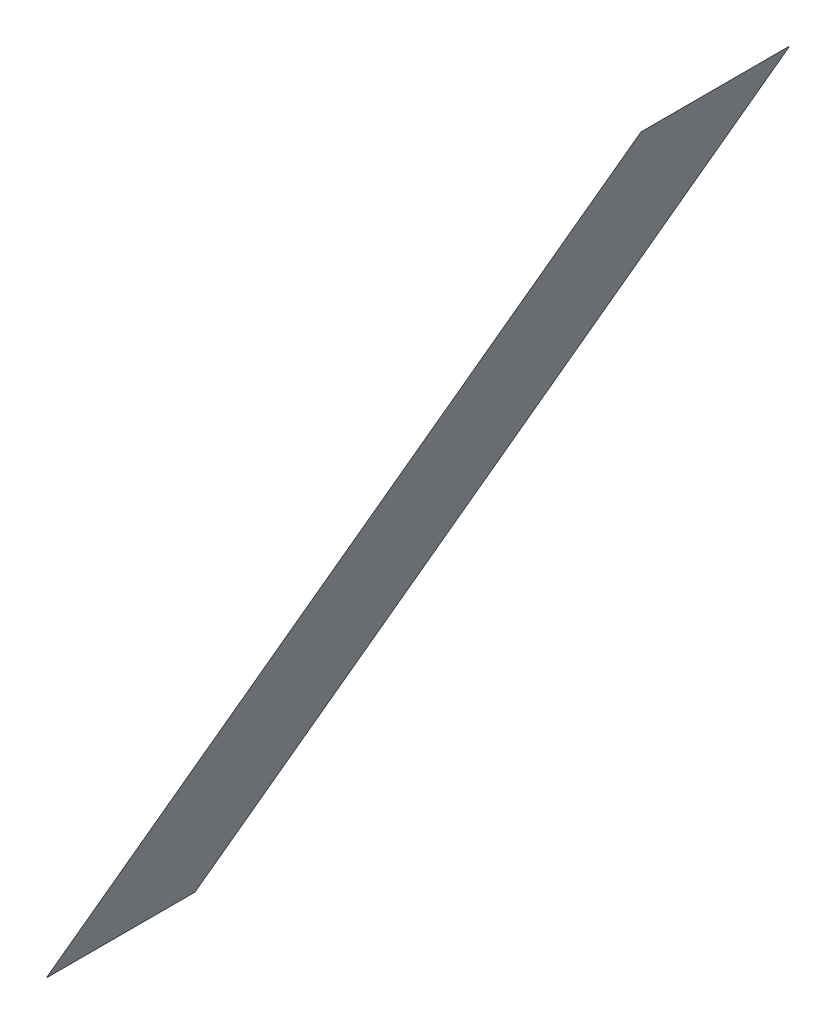
ISO-10303-21;
HEADER;
FILE_DESCRIPTION(('STEP AP214'),'2;1');
FILE_NAME('part.step','',(''),(''),'','','');
FILE_SCHEMA(('AUTOMOTIVE_DESIGN { 1 0 10303 214 1 1 1 1 }'));
ENDSEC;
DATA;
#1=APPLICATION_CONTEXT('core data for automotive mechanical design processes');
#2=APPLICATION_PROTOCOL_DEFINITION('international standard','automotive_design',2000,#1);
#3=PRODUCT_CONTEXT('',#1,'mechanical');
#4=PRODUCT('Part','Part','',(#3));
#5=PRODUCT_RELATED_PRODUCT_CATEGORY('part','',(#4));
#6=PRODUCT_DEFINITION_FORMATION('','',#4);
#7=PRODUCT_DEFINITION_CONTEXT('part definition',#1,'design');
#8=PRODUCT_DEFINITION('design','',#6,#7);
#9=PRODUCT_DEFINITION_SHAPE('','',#8);
#10=(LENGTH_UNIT() NAMED_UNIT(*) SI_UNIT(.MILLI.,.METRE.));
#11=(NAMED_UNIT(*) PLANE_ANGLE_UNIT() SI_UNIT($,.RADIAN.));
#12=(NAMED_UNIT(*) SI_UNIT($,.STERADIAN.) SOLID_ANGLE_UNIT());
#13=UNCERTAINTY_MEASURE_WITH_UNIT(LENGTH_MEASURE(1.E-05),#10,'distance_accuracy_value','');
#14=(GEOMETRIC_REPRESENTATION_CONTEXT(3) GLOBAL_UNCERTAINTY_ASSIGNED_CONTEXT((#13)) GLOBAL_UNIT_ASSIGNED_CONTEXT((#10,
#11,#12)) REPRESENTATION_CONTEXT('',''));
#15=CARTESIAN_POINT('',(0.,0.,0.));
#16=DIRECTION('',(0.,0.,1.));
#17=DIRECTION('',(1.,0.,0.));
#18=AXIS2_PLACEMENT_3D('',#15,#16,#17);
#19=CARTESIAN_POINT('',(63.5755773510828,-191.88387420035,-260.));
#20=DIRECTION('',(0.,0.,1.));
#21=DIRECTION('',(1.,0.,0.));
#22=AXIS2_PLACEMENT_3D('',#19,#20,#21);
#23=PLANE('',#22);
#24=DIRECTION('',(-0.499999988947861,-0.866025410165394,0.));
#25=VECTOR('',#24,1.);
#26=CARTESIAN_POINT('',(172.179452182066,4.22345519411566,-260.));
#27=LINE('',#26,#25);
#28=CARTESIAN_POINT('',(70.1115211684934,-172.563392355155,-260.));
#29=VERTEX_POINT('',#28);
#30=CARTESIAN_POINT('',(50.1115216105789,-207.204408761771,-260.));
#31=VERTEX_POINT('',#30);
#32=EDGE_CURVE('E124',#29,#31,#27,.T.);
#33=ORIENTED_EDGE('',*,*,#32,.F.);
#34=DIRECTION('',(-0.866025403784439,0.5,0.));
#35=VECTOR('',#34,1.);
#36=CARTESIAN_POINT('',(77.0396770940846,-176.563365043783,-260.));
#37=LINE('',#36,#35);
#38=CARTESIAN_POINT('',(70.1114776080811,-172.563367205539,-260.));
#39=VERTEX_POINT('',#38);
#40=EDGE_CURVE('E11',#29,#39,#37,.T.);
#41=ORIENTED_EDGE('',*,*,#40,.T.);
#42=DIRECTION('',(-0.5,-0.866025403784439,0.));
#43=VECTOR('',#42,1.);
#44=CARTESIAN_POINT('',(70.1114776080811,-172.563367205539,-260.));
#45=LINE('',#44,#43);
#46=CARTESIAN_POINT('',(50.1114776080811,-207.204383356917,-260.));
#47=VERTEX_POINT('',#46);
#48=EDGE_CURVE('E72',#39,#47,#45,.T.);
#49=ORIENTED_EDGE('',*,*,#48,.T.);
#50=DIRECTION('',(0.866025403784439,-0.5,0.));
#51=VECTOR('',#50,1.);
#52=CARTESIAN_POINT('',(50.1114776080811,-207.204383356917,-260.));
#53=LINE('',#52,#51);
#54=EDGE_CURVE('E134',#47,#31,#53,.T.);
#55=ORIENTED_EDGE('',*,*,#54,.T.);
#56=EDGE_LOOP('',(#33,#41,#49,#55));
#57=FACE_BOUND('',#56,.T.);
#58=ADVANCED_FACE('F48',(#57),#23,.T.);
#59=CARTESIAN_POINT('',(77.0396770940846,-176.563365043783,-265.));
#60=DIRECTION('',(0.5,0.866025403784438,0.));
#61=DIRECTION('',(0.,0.,-1.));
#62=AXIS2_PLACEMENT_3D('',#59,#60,#61);
#63=PLANE('',#62);
#64=DIRECTION('',(0.,0.,-1.));
#65=VECTOR('',#64,1.);
#66=CARTESIAN_POINT('',(70.1115211684933,-172.563392355155,-163.75));
#67=LINE('',#66,#65);
#68=CARTESIAN_POINT('',(70.1115211684933,-172.563392355155,-265.));
#69=VERTEX_POINT('',#68);
#70=EDGE_CURVE('E130',#29,#69,#67,.T.);
#71=ORIENTED_EDGE('',*,*,#70,.T.);
#72=DIRECTION('',(-0.866025403784439,0.5,0.));
#73=VECTOR('',#72,1.);
#74=CARTESIAN_POINT('',(77.0396770940846,-176.563365043783,-265.));
#75=LINE('',#74,#73);
#76=CARTESIAN_POINT('',(70.1114776080811,-172.563367205539,-265.));
#77=VERTEX_POINT('',#76);
#78=EDGE_CURVE('E117',#69,#77,#75,.T.);
#79=ORIENTED_EDGE('',*,*,#78,.T.);
#80=DIRECTION('',(0.,0.,1.));
#81=VECTOR('',#80,1.);
#82=CARTESIAN_POINT('',(70.1114776080811,-172.563367205539,-265.));
#83=LINE('',#82,#81);
#84=EDGE_CURVE('E56',#77,#39,#83,.T.);
#85=ORIENTED_EDGE('',*,*,#84,.T.);
#86=ORIENTED_EDGE('',*,*,#40,.F.);
#87=EDGE_LOOP('',(#71,#79,#85,#86));
#88=FACE_BOUND('',#87,.T.);
#89=ADVANCED_FACE('F149',(#88),#63,.T.);
#90=CARTESIAN_POINT('',(70.1114776080811,-172.563367205539,-265.));
#91=DIRECTION('',(-0.866025403784438,0.5,0.));
#92=DIRECTION('',(0.,0.,1.));
#93=AXIS2_PLACEMENT_3D('',#90,#91,#92);
#94=PLANE('',#93);
#95=DIRECTION('',(-0.5,-0.866025403784439,0.));
#96=VECTOR('',#95,1.);
#97=CARTESIAN_POINT('',(70.1114776080811,-172.563367205539,-265.));
#98=LINE('',#97,#96);
#99=CARTESIAN_POINT('',(50.1114776080811,-207.204383356917,-265.));
#100=VERTEX_POINT('',#99);
#101=EDGE_CURVE('E111',#77,#100,#98,.T.);
#102=ORIENTED_EDGE('',*,*,#101,.T.);
#103=DIRECTION('',(0.,0.,1.));
#104=VECTOR('',#103,1.);
#105=CARTESIAN_POINT('',(50.1114776080811,-207.204383356917,-265.));
#106=LINE('',#105,#104);
#107=EDGE_CURVE('E106',#100,#47,#106,.T.);
#108=ORIENTED_EDGE('',*,*,#107,.T.);
#109=ORIENTED_EDGE('',*,*,#48,.F.);
#110=ORIENTED_EDGE('',*,*,#84,.F.);
#111=EDGE_LOOP('',(#102,#108,#109,#110));
#112=FACE_BOUND('',#111,.T.);
#113=ADVANCED_FACE('F151',(#112),#94,.T.);
#114=CARTESIAN_POINT('',(50.1114776080811,-207.204383356917,-265.));
#115=DIRECTION('',(-0.5,-0.866025403784438,0.));
#116=DIRECTION('',(-0.866025403784438,0.5,0.));
#117=AXIS2_PLACEMENT_3D('',#114,#115,#116);
#118=PLANE('',#117);
#119=DIRECTION('',(0.,0.,1.));
#120=VECTOR('',#119,1.);
#121=CARTESIAN_POINT('',(50.1115216105789,-207.204408761771,-163.75));
#122=LINE('',#121,#120);
#123=CARTESIAN_POINT('',(50.1115216105789,-207.204408761771,-265.));
#124=VERTEX_POINT('',#123);
#125=EDGE_CURVE('E104',#124,#31,#122,.T.);
#126=ORIENTED_EDGE('',*,*,#125,.T.);
#127=ORIENTED_EDGE('',*,*,#54,.F.);
#128=ORIENTED_EDGE('',*,*,#107,.F.);
#129=DIRECTION('',(0.866025403784439,-0.5,0.));
#130=VECTOR('',#129,1.);
#131=CARTESIAN_POINT('',(50.1114776080811,-207.204383356917,-265.));
#132=LINE('',#131,#130);
#133=EDGE_CURVE('E99',#100,#124,#132,.T.);
#134=ORIENTED_EDGE('',*,*,#133,.T.);
#135=EDGE_LOOP('',(#126,#127,#128,#134));
#136=FACE_BOUND('',#135,.T.);
#137=ADVANCED_FACE('F101',(#136),#118,.T.);
#138=CARTESIAN_POINT('',(63.5755773510828,-191.88387420035,-265.));
#139=DIRECTION('',(0.,0.,1.));
#140=DIRECTION('',(1.,0.,0.));
#141=AXIS2_PLACEMENT_3D('',#138,#139,#140);
#142=PLANE('',#141);
#143=DIRECTION('',(-0.499999988947861,-0.866025410165394,0.));
#144=VECTOR('',#143,1.);
#145=CARTESIAN_POINT('',(93.9973244540006,-131.191966265747,-265.));
#146=LINE('',#145,#144);
#147=EDGE_CURVE('E112',#69,#124,#146,.T.);
#148=ORIENTED_EDGE('',*,*,#147,.T.);
#149=ORIENTED_EDGE('',*,*,#133,.F.);
#150=ORIENTED_EDGE('',*,*,#101,.F.);
#151=ORIENTED_EDGE('',*,*,#78,.F.);
#152=EDGE_LOOP('',(#148,#149,#150,#151));
#153=FACE_BOUND('',#152,.T.);
#154=ADVANCED_FACE('F115',(#153),#142,.F.);
#155=CARTESIAN_POINT('',(127.883127543988,-72.5000319288229,-62.5));
#156=DIRECTION('',(-0.866025410165394,0.499999988947861,0.));
#157=DIRECTION('',(0.,0.,1.));
#158=AXIS2_PLACEMENT_3D('',#155,#156,#157);
#159=PLANE('',#158);
#160=ORIENTED_EDGE('',*,*,#70,.F.);
#161=ORIENTED_EDGE('',*,*,#32,.T.);
#162=ORIENTED_EDGE('',*,*,#125,.F.);
#163=ORIENTED_EDGE('',*,*,#147,.F.);
#164=EDGE_LOOP('',(#160,#161,#162,#163));
#165=FACE_BOUND('',#164,.T.);
#166=ADVANCED_FACE('F123',(#165),#159,.F.);
#167=CLOSED_SHELL('',(#58,#89,#113,#137,#154,#166));
#168=MANIFOLD_SOLID_BREP('B2',#167);
#169=ADVANCED_BREP_SHAPE_REPRESENTATION('',(#18,#168),#14);
#170=SHAPE_DEFINITION_REPRESENTATION(#9,#169);
ENDSEC;
END-ISO-10303-21;
